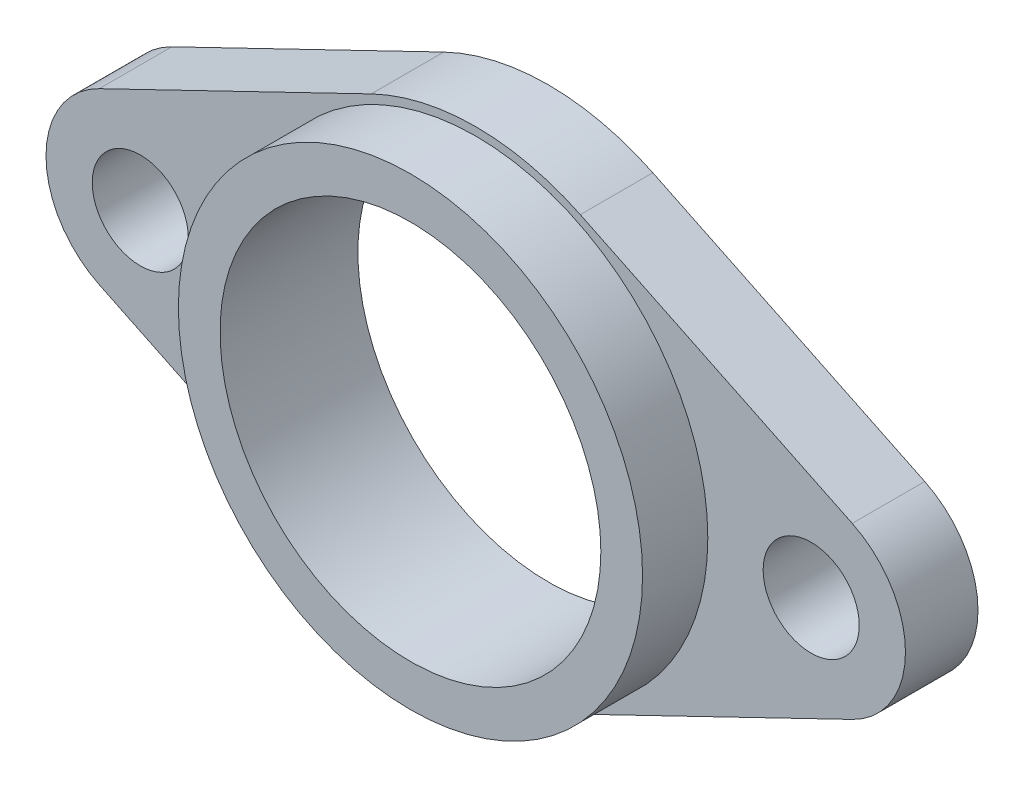
ISO-10303-21;
HEADER;
FILE_DESCRIPTION(('STEP AP214'),'2;1');
FILE_NAME('part.step','',(''),(''),'','','');
FILE_SCHEMA(('AUTOMOTIVE_DESIGN { 1 0 10303 214 1 1 1 1 }'));
ENDSEC;
DATA;
#1=APPLICATION_CONTEXT('core data for automotive mechanical design processes');
#2=APPLICATION_PROTOCOL_DEFINITION('international standard','automotive_design',2000,#1);
#3=PRODUCT_CONTEXT('',#1,'mechanical');
#4=PRODUCT('Part','Part','',(#3));
#5=PRODUCT_RELATED_PRODUCT_CATEGORY('part','',(#4));
#6=PRODUCT_DEFINITION_FORMATION('','',#4);
#7=PRODUCT_DEFINITION_CONTEXT('part definition',#1,'design');
#8=PRODUCT_DEFINITION('design','',#6,#7);
#9=PRODUCT_DEFINITION_SHAPE('','',#8);
#10=(LENGTH_UNIT() NAMED_UNIT(*) SI_UNIT(.MILLI.,.METRE.));
#11=(NAMED_UNIT(*) PLANE_ANGLE_UNIT() SI_UNIT($,.RADIAN.));
#12=(NAMED_UNIT(*) SI_UNIT($,.STERADIAN.) SOLID_ANGLE_UNIT());
#13=UNCERTAINTY_MEASURE_WITH_UNIT(LENGTH_MEASURE(1.E-05),#10,'distance_accuracy_value','');
#14=(GEOMETRIC_REPRESENTATION_CONTEXT(3) GLOBAL_UNCERTAINTY_ASSIGNED_CONTEXT((#13)) GLOBAL_UNIT_ASSIGNED_CONTEXT((#10,
#11,#12)) REPRESENTATION_CONTEXT('',''));
#15=CARTESIAN_POINT('',(0.,0.,0.));
#16=DIRECTION('',(0.,0.,1.));
#17=DIRECTION('',(1.,0.,0.));
#18=AXIS2_PLACEMENT_3D('',#15,#16,#17);
#19=CARTESIAN_POINT('',(-18.5,0.,0.));
#20=DIRECTION('',(0.,0.,1.));
#21=DIRECTION('',(1.,0.,0.));
#22=AXIS2_PLACEMENT_3D('',#19,#20,#21);
#23=PLANE('',#22);
#24=CARTESIAN_POINT('',(0.,0.,0.));
#25=DIRECTION('',(0.,0.,1.));
#26=DIRECTION('',(1.,0.,0.));
#27=AXIS2_PLACEMENT_3D('',#24,#25,#26);
#28=CIRCLE('',#27,10.5);
#29=CARTESIAN_POINT('',(10.5,0.,0.));
#30=VERTEX_POINT('',#29);
#31=EDGE_CURVE('E137',#30,#30,#28,.T.);
#32=ORIENTED_EDGE('',*,*,#31,.T.);
#33=EDGE_LOOP('',(#32));
#34=FACE_BOUND('',#33,.T.);
#35=CARTESIAN_POINT('',(-18.5,0.,0.));
#36=DIRECTION('',(0.,0.,1.));
#37=DIRECTION('',(1.,0.,0.));
#38=AXIS2_PLACEMENT_3D('',#35,#36,#37);
#39=CIRCLE('',#38,5.2);
#40=CARTESIAN_POINT('',(-20.7627027027027,4.68189881129248,0.));
#41=VERTEX_POINT('',#40);
#42=CARTESIAN_POINT('',(-20.7627027027027,-4.68189881129247,0.));
#43=VERTEX_POINT('',#42);
#44=EDGE_CURVE('E133',#41,#43,#39,.T.);
#45=ORIENTED_EDGE('',*,*,#44,.F.);
#46=DIRECTION('',(-0.900365156017784,-0.435135135135135,0.));
#47=VECTOR('',#46,1.);
#48=CARTESIAN_POINT('',(-20.7627027027027,4.68189881129248,0.));
#49=LINE('',#48,#47);
#50=CARTESIAN_POINT('',(-5.76554054054054,11.9298383172356,0.));
#51=VERTEX_POINT('',#50);
#52=EDGE_CURVE('E87',#51,#41,#49,.T.);
#53=ORIENTED_EDGE('',*,*,#52,.F.);
#54=CARTESIAN_POINT('',(0.,0.,0.));
#55=DIRECTION('',(0.,0.,1.));
#56=DIRECTION('',(1.,0.,0.));
#57=AXIS2_PLACEMENT_3D('',#54,#55,#56);
#58=CIRCLE('',#57,13.25);
#59=CARTESIAN_POINT('',(5.76554054054054,11.9298383172356,0.));
#60=VERTEX_POINT('',#59);
#61=EDGE_CURVE('E81',#60,#51,#58,.T.);
#62=ORIENTED_EDGE('',*,*,#61,.F.);
#63=DIRECTION('',(-0.900365156017784,0.435135135135135,0.));
#64=VECTOR('',#63,1.);
#65=CARTESIAN_POINT('',(5.76554054054054,11.9298383172356,0.));
#66=LINE('',#65,#64);
#67=CARTESIAN_POINT('',(20.7627027027027,4.68189881129248,0.));
#68=VERTEX_POINT('',#67);
#69=EDGE_CURVE('E123',#68,#60,#66,.T.);
#70=ORIENTED_EDGE('',*,*,#69,.F.);
#71=CARTESIAN_POINT('',(18.5,0.,0.));
#72=DIRECTION('',(0.,0.,1.));
#73=DIRECTION('',(1.,0.,0.));
#74=AXIS2_PLACEMENT_3D('',#71,#72,#73);
#75=CIRCLE('',#74,5.2);
#76=CARTESIAN_POINT('',(20.7627027027027,-4.68189881129248,0.));
#77=VERTEX_POINT('',#76);
#78=EDGE_CURVE('E143',#77,#68,#75,.T.);
#79=ORIENTED_EDGE('',*,*,#78,.F.);
#80=DIRECTION('',(0.900365156017784,0.435135135135135,0.));
#81=VECTOR('',#80,1.);
#82=CARTESIAN_POINT('',(20.7627027027027,-4.68189881129248,0.));
#83=LINE('',#82,#81);
#84=CARTESIAN_POINT('',(5.76554054054054,-11.9298383172356,0.));
#85=VERTEX_POINT('',#84);
#86=EDGE_CURVE('E141',#85,#77,#83,.T.);
#87=ORIENTED_EDGE('',*,*,#86,.F.);
#88=CARTESIAN_POINT('',(0.,0.,0.));
#89=DIRECTION('',(0.,0.,1.));
#90=DIRECTION('',(1.,0.,0.));
#91=AXIS2_PLACEMENT_3D('',#88,#89,#90);
#92=CIRCLE('',#91,13.25);
#93=CARTESIAN_POINT('',(-5.76554054054054,-11.9298383172356,0.));
#94=VERTEX_POINT('',#93);
#95=EDGE_CURVE('E139',#94,#85,#92,.T.);
#96=ORIENTED_EDGE('',*,*,#95,.F.);
#97=DIRECTION('',(0.900365156017784,-0.435135135135135,0.));
#98=VECTOR('',#97,1.);
#99=CARTESIAN_POINT('',(-20.7627027027027,-4.68189881129247,0.));
#100=LINE('',#99,#98);
#101=EDGE_CURVE('E136',#43,#94,#100,.T.);
#102=ORIENTED_EDGE('',*,*,#101,.F.);
#103=EDGE_LOOP('',(#45,#53,#62,#70,#79,#87,#96,#102));
#104=FACE_BOUND('',#103,.T.);
#105=CARTESIAN_POINT('',(18.5,0.,0.));
#106=DIRECTION('',(0.,0.,-1.));
#107=DIRECTION('',(-1.,0.,0.));
#108=AXIS2_PLACEMENT_3D('',#105,#106,#107);
#109=CIRCLE('',#108,2.65);
#110=CARTESIAN_POINT('',(15.85,0.,0.));
#111=VERTEX_POINT('',#110);
#112=EDGE_CURVE('E195',#111,#111,#109,.T.);
#113=ORIENTED_EDGE('',*,*,#112,.F.);
#114=EDGE_LOOP('',(#113));
#115=FACE_BOUND('',#114,.T.);
#116=CARTESIAN_POINT('',(-18.5,0.,0.));
#117=DIRECTION('',(0.,0.,-1.));
#118=DIRECTION('',(-1.,0.,0.));
#119=AXIS2_PLACEMENT_3D('',#116,#117,#118);
#120=CIRCLE('',#119,2.65);
#121=CARTESIAN_POINT('',(-21.15,0.,0.));
#122=VERTEX_POINT('',#121);
#123=EDGE_CURVE('E201',#122,#122,#120,.T.);
#124=ORIENTED_EDGE('',*,*,#123,.F.);
#125=EDGE_LOOP('',(#124));
#126=FACE_BOUND('',#125,.T.);
#127=ADVANCED_FACE('F35',(#34,#104,#115,#126),#23,.F.);
#128=CARTESIAN_POINT('',(-18.5,0.,4.));
#129=DIRECTION('',(0.,0.,1.));
#130=DIRECTION('',(1.,0.,0.));
#131=AXIS2_PLACEMENT_3D('',#128,#129,#130);
#132=PLANE('',#131);
#133=CARTESIAN_POINT('',(-18.5,0.,4.));
#134=DIRECTION('',(0.,0.,1.));
#135=DIRECTION('',(1.,0.,0.));
#136=AXIS2_PLACEMENT_3D('',#133,#134,#135);
#137=CIRCLE('',#136,2.65);
#138=CARTESIAN_POINT('',(-15.85,0.,4.));
#139=VERTEX_POINT('',#138);
#140=EDGE_CURVE('E198',#139,#139,#137,.T.);
#141=ORIENTED_EDGE('',*,*,#140,.F.);
#142=EDGE_LOOP('',(#141));
#143=FACE_BOUND('',#142,.T.);
#144=CARTESIAN_POINT('',(18.5,0.,4.));
#145=DIRECTION('',(0.,0.,1.));
#146=DIRECTION('',(1.,0.,0.));
#147=AXIS2_PLACEMENT_3D('',#144,#145,#146);
#148=CIRCLE('',#147,2.65);
#149=CARTESIAN_POINT('',(21.15,0.,4.));
#150=VERTEX_POINT('',#149);
#151=EDGE_CURVE('E192',#150,#150,#148,.T.);
#152=ORIENTED_EDGE('',*,*,#151,.F.);
#153=EDGE_LOOP('',(#152));
#154=FACE_BOUND('',#153,.T.);
#155=CARTESIAN_POINT('',(-18.5,0.,4.));
#156=DIRECTION('',(0.,0.,1.));
#157=DIRECTION('',(1.,0.,0.));
#158=AXIS2_PLACEMENT_3D('',#155,#156,#157);
#159=CIRCLE('',#158,5.2);
#160=CARTESIAN_POINT('',(-20.7627027027027,4.68189881129248,4.));
#161=VERTEX_POINT('',#160);
#162=CARTESIAN_POINT('',(-20.7627027027027,-4.68189881129247,4.));
#163=VERTEX_POINT('',#162);
#164=EDGE_CURVE('E148',#161,#163,#159,.T.);
#165=ORIENTED_EDGE('',*,*,#164,.T.);
#166=DIRECTION('',(0.900365156017784,-0.435135135135135,0.));
#167=VECTOR('',#166,1.);
#168=CARTESIAN_POINT('',(-20.7627027027027,-4.68189881129247,4.));
#169=LINE('',#168,#167);
#170=CARTESIAN_POINT('',(-5.76554054054054,-11.9298383172356,4.));
#171=VERTEX_POINT('',#170);
#172=EDGE_CURVE('E95',#163,#171,#169,.T.);
#173=ORIENTED_EDGE('',*,*,#172,.T.);
#174=CARTESIAN_POINT('',(0.,0.,4.));
#175=DIRECTION('',(0.,0.,1.));
#176=DIRECTION('',(1.,0.,0.));
#177=AXIS2_PLACEMENT_3D('',#174,#175,#176);
#178=CIRCLE('',#177,13.25);
#179=CARTESIAN_POINT('',(5.76554054054054,-11.9298383172356,4.));
#180=VERTEX_POINT('',#179);
#181=EDGE_CURVE('E163',#171,#180,#178,.T.);
#182=ORIENTED_EDGE('',*,*,#181,.T.);
#183=DIRECTION('',(0.900365156017784,0.435135135135135,0.));
#184=VECTOR('',#183,1.);
#185=CARTESIAN_POINT('',(20.7627027027027,-4.68189881129248,4.));
#186=LINE('',#185,#184);
#187=CARTESIAN_POINT('',(20.7627027027027,-4.68189881129248,4.));
#188=VERTEX_POINT('',#187);
#189=EDGE_CURVE('E175',#180,#188,#186,.T.);
#190=ORIENTED_EDGE('',*,*,#189,.T.);
#191=CARTESIAN_POINT('',(18.5,0.,4.));
#192=DIRECTION('',(0.,0.,1.));
#193=DIRECTION('',(1.,0.,0.));
#194=AXIS2_PLACEMENT_3D('',#191,#192,#193);
#195=CIRCLE('',#194,5.2);
#196=CARTESIAN_POINT('',(20.7627027027027,4.68189881129248,4.));
#197=VERTEX_POINT('',#196);
#198=EDGE_CURVE('E115',#188,#197,#195,.T.);
#199=ORIENTED_EDGE('',*,*,#198,.T.);
#200=DIRECTION('',(-0.900365156017784,0.435135135135135,0.));
#201=VECTOR('',#200,1.);
#202=CARTESIAN_POINT('',(5.76554054054054,11.9298383172356,4.));
#203=LINE('',#202,#201);
#204=CARTESIAN_POINT('',(5.76554054054054,11.9298383172356,4.));
#205=VERTEX_POINT('',#204);
#206=EDGE_CURVE('E108',#197,#205,#203,.T.);
#207=ORIENTED_EDGE('',*,*,#206,.T.);
#208=CARTESIAN_POINT('',(0.,0.,4.));
#209=DIRECTION('',(0.,0.,1.));
#210=DIRECTION('',(1.,0.,0.));
#211=AXIS2_PLACEMENT_3D('',#208,#209,#210);
#212=CIRCLE('',#211,13.25);
#213=CARTESIAN_POINT('',(-5.76554054054054,11.9298383172356,4.));
#214=VERTEX_POINT('',#213);
#215=EDGE_CURVE('E113',#205,#214,#212,.T.);
#216=ORIENTED_EDGE('',*,*,#215,.T.);
#217=DIRECTION('',(-0.900365156017784,-0.435135135135135,0.));
#218=VECTOR('',#217,1.);
#219=CARTESIAN_POINT('',(-20.7627027027027,4.68189881129248,4.));
#220=LINE('',#219,#218);
#221=EDGE_CURVE('E52',#214,#161,#220,.T.);
#222=ORIENTED_EDGE('',*,*,#221,.T.);
#223=EDGE_LOOP('',(#165,#173,#182,#190,#199,#207,#216,#222));
#224=FACE_BOUND('',#223,.T.);
#225=CARTESIAN_POINT('',(0.,0.,4.));
#226=DIRECTION('',(0.,0.,1.));
#227=DIRECTION('',(1.,0.,0.));
#228=AXIS2_PLACEMENT_3D('',#225,#226,#227);
#229=CIRCLE('',#228,12.8);
#230=CARTESIAN_POINT('',(-12.8,0.,4.));
#231=VERTEX_POINT('',#230);
#232=EDGE_CURVE('E183',#231,#231,#229,.F.);
#233=ORIENTED_EDGE('',*,*,#232,.T.);
#234=EDGE_LOOP('',(#233));
#235=FACE_BOUND('',#234,.T.);
#236=ADVANCED_FACE('F110',(#143,#154,#224,#235),#132,.T.);
#237=CARTESIAN_POINT('',(-18.5,0.,4.));
#238=DIRECTION('',(0.,0.,-1.));
#239=DIRECTION('',(-1.,0.,0.));
#240=AXIS2_PLACEMENT_3D('',#237,#238,#239);
#241=CYLINDRICAL_SURFACE('',#240,5.2);
#242=ORIENTED_EDGE('',*,*,#44,.T.);
#243=DIRECTION('',(0.,0.,-1.));
#244=VECTOR('',#243,1.);
#245=CARTESIAN_POINT('',(-20.7627027027027,-4.68189881129247,4.));
#246=LINE('',#245,#244);
#247=EDGE_CURVE('E11',#163,#43,#246,.T.);
#248=ORIENTED_EDGE('',*,*,#247,.F.);
#249=ORIENTED_EDGE('',*,*,#164,.F.);
#250=DIRECTION('',(0.,0.,-1.));
#251=VECTOR('',#250,1.);
#252=CARTESIAN_POINT('',(-20.7627027027027,4.68189881129248,4.));
#253=LINE('',#252,#251);
#254=EDGE_CURVE('E129',#161,#41,#253,.T.);
#255=ORIENTED_EDGE('',*,*,#254,.T.);
#256=EDGE_LOOP('',(#242,#248,#249,#255));
#257=FACE_BOUND('',#256,.T.);
#258=ADVANCED_FACE('F37',(#257),#241,.T.);
#259=CARTESIAN_POINT('',(-20.7627027027027,-4.68189881129247,4.));
#260=DIRECTION('',(0.435135135135135,0.900365156017784,0.));
#261=DIRECTION('',(-0.900365156017784,0.435135135135135,0.));
#262=AXIS2_PLACEMENT_3D('',#259,#260,#261);
#263=PLANE('',#262);
#264=ORIENTED_EDGE('',*,*,#101,.T.);
#265=DIRECTION('',(0.,0.,-1.));
#266=VECTOR('',#265,1.);
#267=CARTESIAN_POINT('',(-5.76554054054054,-11.9298383172356,4.));
#268=LINE('',#267,#266);
#269=EDGE_CURVE('E44',#171,#94,#268,.T.);
#270=ORIENTED_EDGE('',*,*,#269,.F.);
#271=ORIENTED_EDGE('',*,*,#172,.F.);
#272=ORIENTED_EDGE('',*,*,#247,.T.);
#273=EDGE_LOOP('',(#264,#270,#271,#272));
#274=FACE_BOUND('',#273,.T.);
#275=ADVANCED_FACE('F231',(#274),#263,.F.);
#276=CARTESIAN_POINT('',(0.,0.,4.));
#277=DIRECTION('',(0.,0.,-1.));
#278=DIRECTION('',(-1.,0.,0.));
#279=AXIS2_PLACEMENT_3D('',#276,#277,#278);
#280=CYLINDRICAL_SURFACE('',#279,13.25);
#281=ORIENTED_EDGE('',*,*,#95,.T.);
#282=DIRECTION('',(0.,0.,-1.));
#283=VECTOR('',#282,1.);
#284=CARTESIAN_POINT('',(5.76554054054054,-11.9298383172356,4.));
#285=LINE('',#284,#283);
#286=EDGE_CURVE('E155',#180,#85,#285,.T.);
#287=ORIENTED_EDGE('',*,*,#286,.F.);
#288=ORIENTED_EDGE('',*,*,#181,.F.);
#289=ORIENTED_EDGE('',*,*,#269,.T.);
#290=EDGE_LOOP('',(#281,#287,#288,#289));
#291=FACE_BOUND('',#290,.T.);
#292=ADVANCED_FACE('F161',(#291),#280,.T.);
#293=CARTESIAN_POINT('',(20.7627027027027,-4.68189881129248,4.));
#294=DIRECTION('',(-0.435135135135135,0.900365156017784,0.));
#295=DIRECTION('',(-0.900365156017784,-0.435135135135135,0.));
#296=AXIS2_PLACEMENT_3D('',#293,#294,#295);
#297=PLANE('',#296);
#298=ORIENTED_EDGE('',*,*,#86,.T.);
#299=DIRECTION('',(0.,0.,-1.));
#300=VECTOR('',#299,1.);
#301=CARTESIAN_POINT('',(20.7627027027027,-4.68189881129248,4.));
#302=LINE('',#301,#300);
#303=EDGE_CURVE('E152',#188,#77,#302,.T.);
#304=ORIENTED_EDGE('',*,*,#303,.F.);
#305=ORIENTED_EDGE('',*,*,#189,.F.);
#306=ORIENTED_EDGE('',*,*,#286,.T.);
#307=EDGE_LOOP('',(#298,#304,#305,#306));
#308=FACE_BOUND('',#307,.T.);
#309=ADVANCED_FACE('F171',(#308),#297,.F.);
#310=CARTESIAN_POINT('',(18.5,0.,4.));
#311=DIRECTION('',(0.,0.,-1.));
#312=DIRECTION('',(-1.,0.,0.));
#313=AXIS2_PLACEMENT_3D('',#310,#311,#312);
#314=CYLINDRICAL_SURFACE('',#313,5.2);
#315=ORIENTED_EDGE('',*,*,#78,.T.);
#316=DIRECTION('',(0.,0.,-1.));
#317=VECTOR('',#316,1.);
#318=CARTESIAN_POINT('',(20.7627027027027,4.68189881129248,4.));
#319=LINE('',#318,#317);
#320=EDGE_CURVE('E124',#197,#68,#319,.T.);
#321=ORIENTED_EDGE('',*,*,#320,.F.);
#322=ORIENTED_EDGE('',*,*,#198,.F.);
#323=ORIENTED_EDGE('',*,*,#303,.T.);
#324=EDGE_LOOP('',(#315,#321,#322,#323));
#325=FACE_BOUND('',#324,.T.);
#326=ADVANCED_FACE('F174',(#325),#314,.T.);
#327=CARTESIAN_POINT('',(5.76554054054054,11.9298383172356,4.));
#328=DIRECTION('',(-0.435135135135135,-0.900365156017784,0.));
#329=DIRECTION('',(0.900365156017784,-0.435135135135135,0.));
#330=AXIS2_PLACEMENT_3D('',#327,#328,#329);
#331=PLANE('',#330);
#332=ORIENTED_EDGE('',*,*,#69,.T.);
#333=DIRECTION('',(0.,0.,-1.));
#334=VECTOR('',#333,1.);
#335=CARTESIAN_POINT('',(5.76554054054054,11.9298383172356,4.));
#336=LINE('',#335,#334);
#337=EDGE_CURVE('E120',#205,#60,#336,.T.);
#338=ORIENTED_EDGE('',*,*,#337,.F.);
#339=ORIENTED_EDGE('',*,*,#206,.F.);
#340=ORIENTED_EDGE('',*,*,#320,.T.);
#341=EDGE_LOOP('',(#332,#338,#339,#340));
#342=FACE_BOUND('',#341,.T.);
#343=ADVANCED_FACE('F121',(#342),#331,.F.);
#344=CARTESIAN_POINT('',(0.,0.,4.));
#345=DIRECTION('',(0.,0.,-1.));
#346=DIRECTION('',(-1.,0.,0.));
#347=AXIS2_PLACEMENT_3D('',#344,#345,#346);
#348=CYLINDRICAL_SURFACE('',#347,13.25);
#349=ORIENTED_EDGE('',*,*,#61,.T.);
#350=DIRECTION('',(0.,0.,-1.));
#351=VECTOR('',#350,1.);
#352=CARTESIAN_POINT('',(-5.76554054054054,11.9298383172356,4.));
#353=LINE('',#352,#351);
#354=EDGE_CURVE('E125',#214,#51,#353,.T.);
#355=ORIENTED_EDGE('',*,*,#354,.F.);
#356=ORIENTED_EDGE('',*,*,#215,.F.);
#357=ORIENTED_EDGE('',*,*,#337,.T.);
#358=EDGE_LOOP('',(#349,#355,#356,#357));
#359=FACE_BOUND('',#358,.T.);
#360=ADVANCED_FACE('F127',(#359),#348,.T.);
#361=CARTESIAN_POINT('',(-20.7627027027027,4.68189881129248,4.));
#362=DIRECTION('',(0.435135135135135,-0.900365156017784,0.));
#363=DIRECTION('',(0.900365156017784,0.435135135135135,0.));
#364=AXIS2_PLACEMENT_3D('',#361,#362,#363);
#365=PLANE('',#364);
#366=ORIENTED_EDGE('',*,*,#52,.T.);
#367=ORIENTED_EDGE('',*,*,#254,.F.);
#368=ORIENTED_EDGE('',*,*,#221,.F.);
#369=ORIENTED_EDGE('',*,*,#354,.T.);
#370=EDGE_LOOP('',(#366,#367,#368,#369));
#371=FACE_BOUND('',#370,.T.);
#372=ADVANCED_FACE('F218',(#371),#365,.F.);
#373=CARTESIAN_POINT('',(0.,0.,4.));
#374=DIRECTION('',(0.,0.,-1.));
#375=DIRECTION('',(-1.,0.,0.));
#376=AXIS2_PLACEMENT_3D('',#373,#374,#375);
#377=CYLINDRICAL_SURFACE('',#376,10.5);
#378=ORIENTED_EDGE('',*,*,#31,.F.);
#379=EDGE_LOOP('',(#378));
#380=FACE_BOUND('',#379,.T.);
#381=CARTESIAN_POINT('',(0.,0.,7.6));
#382=DIRECTION('',(0.,0.,1.));
#383=DIRECTION('',(1.,0.,0.));
#384=AXIS2_PLACEMENT_3D('',#381,#382,#383);
#385=CIRCLE('',#384,10.5);
#386=CARTESIAN_POINT('',(10.5,0.,7.6));
#387=VERTEX_POINT('',#386);
#388=EDGE_CURVE('E189',#387,#387,#385,.T.);
#389=ORIENTED_EDGE('',*,*,#388,.T.);
#390=EDGE_LOOP('',(#389));
#391=FACE_BOUND('',#390,.T.);
#392=ADVANCED_FACE('F221',(#380,#391),#377,.F.);
#393=CARTESIAN_POINT('',(0.,0.,7.6));
#394=DIRECTION('',(0.,0.,1.));
#395=DIRECTION('',(1.,0.,0.));
#396=AXIS2_PLACEMENT_3D('',#393,#394,#395);
#397=PLANE('',#396);
#398=CARTESIAN_POINT('',(0.,0.,7.6));
#399=DIRECTION('',(0.,0.,1.));
#400=DIRECTION('',(1.,0.,0.));
#401=AXIS2_PLACEMENT_3D('',#398,#399,#400);
#402=CIRCLE('',#401,12.8);
#403=CARTESIAN_POINT('',(-12.8,0.,7.6));
#404=VERTEX_POINT('',#403);
#405=EDGE_CURVE('E186',#404,#404,#402,.T.);
#406=ORIENTED_EDGE('',*,*,#405,.T.);
#407=EDGE_LOOP('',(#406));
#408=FACE_BOUND('',#407,.T.);
#409=ORIENTED_EDGE('',*,*,#388,.F.);
#410=EDGE_LOOP('',(#409));
#411=FACE_BOUND('',#410,.T.);
#412=ADVANCED_FACE('F275',(#408,#411),#397,.T.);
#413=CARTESIAN_POINT('',(0.,0.,7.6));
#414=DIRECTION('',(0.,0.,-1.));
#415=DIRECTION('',(-1.,0.,0.));
#416=AXIS2_PLACEMENT_3D('',#413,#414,#415);
#417=CYLINDRICAL_SURFACE('',#416,12.8);
#418=CARTESIAN_POINT('',(-12.8,0.,4.));
#419=CARTESIAN_POINT('',(-12.8,0.,4.0375));
#420=CARTESIAN_POINT('',(-12.8,0.,4.075));
#421=CARTESIAN_POINT('',(-12.8,0.,4.15));
#422=CARTESIAN_POINT('',(-12.8,0.,4.1875));
#423=CARTESIAN_POINT('',(-12.8,0.,4.2625));
#424=CARTESIAN_POINT('',(-12.8,0.,4.3));
#425=CARTESIAN_POINT('',(-12.8,0.,4.375));
#426=CARTESIAN_POINT('',(-12.8,0.,4.4125));
#427=CARTESIAN_POINT('',(-12.8,0.,4.4875));
#428=CARTESIAN_POINT('',(-12.8,0.,4.525));
#429=CARTESIAN_POINT('',(-12.8,0.,4.6));
#430=CARTESIAN_POINT('',(-12.8,0.,4.6375));
#431=CARTESIAN_POINT('',(-12.8,0.,4.7125));
#432=CARTESIAN_POINT('',(-12.8,0.,4.75));
#433=CARTESIAN_POINT('',(-12.8,0.,4.825));
#434=CARTESIAN_POINT('',(-12.8,0.,4.8625));
#435=CARTESIAN_POINT('',(-12.8,0.,4.9375));
#436=CARTESIAN_POINT('',(-12.8,0.,4.975));
#437=CARTESIAN_POINT('',(-12.8,0.,5.05));
#438=CARTESIAN_POINT('',(-12.8,0.,5.0875));
#439=CARTESIAN_POINT('',(-12.8,0.,5.1625));
#440=CARTESIAN_POINT('',(-12.8,0.,5.2));
#441=CARTESIAN_POINT('',(-12.8,0.,5.275));
#442=CARTESIAN_POINT('',(-12.8,0.,5.3125));
#443=CARTESIAN_POINT('',(-12.8,0.,5.3875));
#444=CARTESIAN_POINT('',(-12.8,0.,5.425));
#445=CARTESIAN_POINT('',(-12.8,0.,5.5));
#446=CARTESIAN_POINT('',(-12.8,0.,5.5375));
#447=CARTESIAN_POINT('',(-12.8,0.,5.6125));
#448=CARTESIAN_POINT('',(-12.8,0.,5.65));
#449=CARTESIAN_POINT('',(-12.8,0.,5.725));
#450=CARTESIAN_POINT('',(-12.8,0.,5.7625));
#451=CARTESIAN_POINT('',(-12.8,0.,5.8375));
#452=CARTESIAN_POINT('',(-12.8,0.,5.875));
#453=CARTESIAN_POINT('',(-12.8,0.,5.95));
#454=CARTESIAN_POINT('',(-12.8,0.,5.9875));
#455=CARTESIAN_POINT('',(-12.8,0.,6.0625));
#456=CARTESIAN_POINT('',(-12.8,0.,6.1));
#457=CARTESIAN_POINT('',(-12.8,0.,6.175));
#458=CARTESIAN_POINT('',(-12.8,0.,6.2125));
#459=CARTESIAN_POINT('',(-12.8,0.,6.2875));
#460=CARTESIAN_POINT('',(-12.8,0.,6.325));
#461=CARTESIAN_POINT('',(-12.8,0.,6.4));
#462=CARTESIAN_POINT('',(-12.8,0.,6.4375));
#463=CARTESIAN_POINT('',(-12.8,0.,6.5125));
#464=CARTESIAN_POINT('',(-12.8,0.,6.55));
#465=CARTESIAN_POINT('',(-12.8,0.,6.625));
#466=CARTESIAN_POINT('',(-12.8,0.,6.6625));
#467=CARTESIAN_POINT('',(-12.8,0.,6.7375));
#468=CARTESIAN_POINT('',(-12.8,0.,6.775));
#469=CARTESIAN_POINT('',(-12.8,0.,6.85));
#470=CARTESIAN_POINT('',(-12.8,0.,6.8875));
#471=CARTESIAN_POINT('',(-12.8,0.,6.9625));
#472=CARTESIAN_POINT('',(-12.8,0.,7.));
#473=CARTESIAN_POINT('',(-12.8,0.,7.075));
#474=CARTESIAN_POINT('',(-12.8,0.,7.1125));
#475=CARTESIAN_POINT('',(-12.8,0.,7.1875));
#476=CARTESIAN_POINT('',(-12.8,0.,7.225));
#477=CARTESIAN_POINT('',(-12.8,0.,7.3));
#478=CARTESIAN_POINT('',(-12.8,0.,7.3375));
#479=CARTESIAN_POINT('',(-12.8,0.,7.4125));
#480=CARTESIAN_POINT('',(-12.8,0.,7.45));
#481=CARTESIAN_POINT('',(-12.8,0.,7.525));
#482=CARTESIAN_POINT('',(-12.8,0.,7.5625));
#483=CARTESIAN_POINT('',(-12.8,0.,7.6));
#484=B_SPLINE_CURVE_WITH_KNOTS('',3,(#418,#419,#420,#421,#422,#423,#424,#425,#426,#427,#428,
#429,#430,#431,#432,#433,#434,#435,#436,#437,#438,#439,#440,#441,#442,#443,#444,#445,#446,#447,
#448,#449,#450,#451,#452,#453,#454,#455,#456,#457,#458,#459,#460,#461,#462,#463,#464,#465,#466,
#467,#468,#469,#470,#471,#472,#473,#474,#475,#476,#477,#478,#479,#480,#481,#482,#483),
.UNSPECIFIED.,.F.,.F.,(4,2,2,2,2,2,2,2,2,2,2,2,2,2,2,2,2,2,2,2,2,2,2,2,2,2,2,2,2,2,2,2,4),(0.,
0.1125,0.225,0.337499999999999,0.449999999999999,0.5625,0.675,0.7875,0.9,1.0125,1.125,1.2375,
1.35,1.4625,1.575,1.6875,1.8,1.9125,2.025,2.1375,2.25,2.3625,2.475,2.5875,2.7,2.8125,2.925,
3.0375,3.15,3.2625,3.375,3.4875,3.6),.UNSPECIFIED.);
#485=EDGE_CURVE('BSEAM260',#231,#404,#484,.T.);
#486=ORIENTED_EDGE('',*,*,#232,.F.);
#487=ORIENTED_EDGE('',*,*,#405,.F.);
#488=ORIENTED_EDGE('',*,*,#485,.T.);
#489=ORIENTED_EDGE('',*,*,#485,.F.);
#490=EDGE_LOOP('',(#486,#488,#487,#489));
#491=FACE_BOUND('',#490,.T.);
#492=ADVANCED_FACE('F260',(#491),#417,.T.);
#493=CARTESIAN_POINT('',(18.5,0.,0.));
#494=DIRECTION('',(0.,0.,-1.));
#495=DIRECTION('',(-1.,0.,0.));
#496=AXIS2_PLACEMENT_3D('',#493,#494,#495);
#497=CYLINDRICAL_SURFACE('',#496,2.65);
#498=ORIENTED_EDGE('',*,*,#112,.T.);
#499=EDGE_LOOP('',(#498));
#500=FACE_BOUND('',#499,.T.);
#501=ORIENTED_EDGE('',*,*,#151,.T.);
#502=EDGE_LOOP('',(#501));
#503=FACE_BOUND('',#502,.T.);
#504=ADVANCED_FACE('F255',(#500,#503),#497,.F.);
#505=CARTESIAN_POINT('',(-18.5,0.,0.));
#506=DIRECTION('',(0.,0.,-1.));
#507=DIRECTION('',(-1.,0.,0.));
#508=AXIS2_PLACEMENT_3D('',#505,#506,#507);
#509=CYLINDRICAL_SURFACE('',#508,2.65);
#510=ORIENTED_EDGE('',*,*,#123,.T.);
#511=EDGE_LOOP('',(#510));
#512=FACE_BOUND('',#511,.T.);
#513=ORIENTED_EDGE('',*,*,#140,.T.);
#514=EDGE_LOOP('',(#513));
#515=FACE_BOUND('',#514,.T.);
#516=ADVANCED_FACE('F205',(#512,#515),#509,.F.);
#517=CLOSED_SHELL('',(#127,#236,#258,#275,#292,#309,#326,#343,#360,#372,#392,#412,#492,#504,#516));
#518=MANIFOLD_SOLID_BREP('B2',#517);
#519=ADVANCED_BREP_SHAPE_REPRESENTATION('',(#18,#518),#14);
#520=SHAPE_DEFINITION_REPRESENTATION(#9,#519);
ENDSEC;
END-ISO-10303-21;
